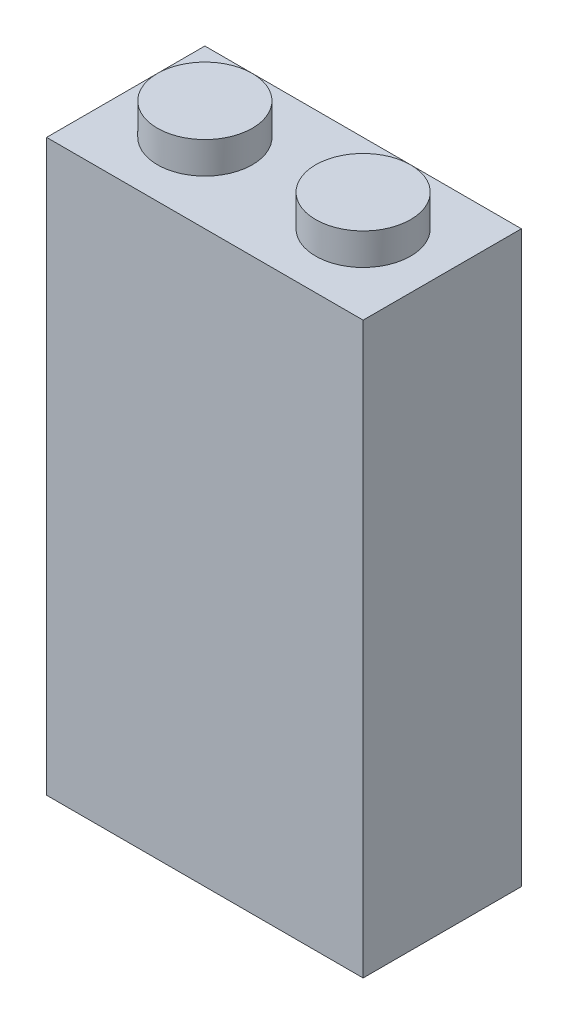
ISO-10303-21;
HEADER;
FILE_DESCRIPTION(('STEP AP214'),'2;1');
FILE_NAME('part.step','',(''),(''),'','','');
FILE_SCHEMA(('AUTOMOTIVE_DESIGN { 1 0 10303 214 1 1 1 1 }'));
ENDSEC;
DATA;
#1=APPLICATION_CONTEXT('core data for automotive mechanical design processes');
#2=APPLICATION_PROTOCOL_DEFINITION('international standard','automotive_design',2000,#1);
#3=PRODUCT_CONTEXT('',#1,'mechanical');
#4=PRODUCT('Part','Part','',(#3));
#5=PRODUCT_RELATED_PRODUCT_CATEGORY('part','',(#4));
#6=PRODUCT_DEFINITION_FORMATION('','',#4);
#7=PRODUCT_DEFINITION_CONTEXT('part definition',#1,'design');
#8=PRODUCT_DEFINITION('design','',#6,#7);
#9=PRODUCT_DEFINITION_SHAPE('','',#8);
#10=(LENGTH_UNIT() NAMED_UNIT(*) SI_UNIT(.MILLI.,.METRE.));
#11=(NAMED_UNIT(*) PLANE_ANGLE_UNIT() SI_UNIT($,.RADIAN.));
#12=(NAMED_UNIT(*) SI_UNIT($,.STERADIAN.) SOLID_ANGLE_UNIT());
#13=UNCERTAINTY_MEASURE_WITH_UNIT(LENGTH_MEASURE(1.E-05),#10,'distance_accuracy_value','');
#14=(GEOMETRIC_REPRESENTATION_CONTEXT(3) GLOBAL_UNCERTAINTY_ASSIGNED_CONTEXT((#13)) GLOBAL_UNIT_ASSIGNED_CONTEXT((#10,
#11,#12)) REPRESENTATION_CONTEXT('',''));
#15=CARTESIAN_POINT('',(0.,0.,0.));
#16=DIRECTION('',(0.,0.,1.));
#17=DIRECTION('',(1.,0.,0.));
#18=AXIS2_PLACEMENT_3D('',#15,#16,#17);
#19=CARTESIAN_POINT('',(0.,0.,0.));
#20=DIRECTION('',(0.,-1.,0.));
#21=DIRECTION('',(0.,0.,-1.));
#22=AXIS2_PLACEMENT_3D('',#19,#20,#21);
#23=PLANE('',#22);
#24=DIRECTION('',(0.,0.,1.));
#25=VECTOR('',#24,1.);
#26=CARTESIAN_POINT('',(0.,0.,0.));
#27=LINE('',#26,#25);
#28=CARTESIAN_POINT('',(0.,0.,-8.));
#29=VERTEX_POINT('',#28);
#30=CARTESIAN_POINT('',(0.,0.,0.));
#31=VERTEX_POINT('',#30);
#32=EDGE_CURVE('E190',#29,#31,#27,.T.);
#33=ORIENTED_EDGE('',*,*,#32,.F.);
#34=DIRECTION('',(-1.,0.,0.));
#35=VECTOR('',#34,1.);
#36=CARTESIAN_POINT('',(0.,0.,-8.));
#37=LINE('',#36,#35);
#38=CARTESIAN_POINT('',(16.,0.,-8.));
#39=VERTEX_POINT('',#38);
#40=EDGE_CURVE('E85',#39,#29,#37,.T.);
#41=ORIENTED_EDGE('',*,*,#40,.F.);
#42=DIRECTION('',(0.,0.,-1.));
#43=VECTOR('',#42,1.);
#44=CARTESIAN_POINT('',(16.,0.,0.));
#45=LINE('',#44,#43);
#46=CARTESIAN_POINT('',(16.,0.,0.));
#47=VERTEX_POINT('',#46);
#48=EDGE_CURVE('E208',#47,#39,#45,.T.);
#49=ORIENTED_EDGE('',*,*,#48,.F.);
#50=DIRECTION('',(1.,0.,0.));
#51=VECTOR('',#50,1.);
#52=CARTESIAN_POINT('',(0.,0.,0.));
#53=LINE('',#52,#51);
#54=EDGE_CURVE('E205',#31,#47,#53,.T.);
#55=ORIENTED_EDGE('',*,*,#54,.F.);
#56=EDGE_LOOP('',(#33,#41,#49,#55));
#57=FACE_BOUND('',#56,.T.);
#58=DIRECTION('',(-1.,0.,0.));
#59=VECTOR('',#58,1.);
#60=CARTESIAN_POINT('',(0.,0.,-6.4));
#61=LINE('',#60,#59);
#62=CARTESIAN_POINT('',(14.4,0.,-6.4));
#63=VERTEX_POINT('',#62);
#64=CARTESIAN_POINT('',(1.6,0.,-6.4));
#65=VERTEX_POINT('',#64);
#66=EDGE_CURVE('E135',#63,#65,#61,.T.);
#67=ORIENTED_EDGE('',*,*,#66,.T.);
#68=DIRECTION('',(0.,0.,1.));
#69=VECTOR('',#68,1.);
#70=CARTESIAN_POINT('',(1.6,0.,0.));
#71=LINE('',#70,#69);
#72=CARTESIAN_POINT('',(1.6,0.,-1.6));
#73=VERTEX_POINT('',#72);
#74=EDGE_CURVE('E169',#65,#73,#71,.T.);
#75=ORIENTED_EDGE('',*,*,#74,.T.);
#76=DIRECTION('',(1.,0.,0.));
#77=VECTOR('',#76,1.);
#78=CARTESIAN_POINT('',(0.,0.,-1.6));
#79=LINE('',#78,#77);
#80=CARTESIAN_POINT('',(14.4,0.,-1.6));
#81=VERTEX_POINT('',#80);
#82=EDGE_CURVE('E139',#73,#81,#79,.T.);
#83=ORIENTED_EDGE('',*,*,#82,.T.);
#84=DIRECTION('',(0.,0.,-1.));
#85=VECTOR('',#84,1.);
#86=CARTESIAN_POINT('',(14.4,0.,0.));
#87=LINE('',#86,#85);
#88=EDGE_CURVE('E55',#81,#63,#87,.T.);
#89=ORIENTED_EDGE('',*,*,#88,.T.);
#90=EDGE_LOOP('',(#67,#75,#83,#89));
#91=FACE_BOUND('',#90,.T.);
#92=ADVANCED_FACE('F39',(#57,#91),#23,.T.);
#93=CARTESIAN_POINT('',(0.,28.8,0.));
#94=DIRECTION('',(1.,0.,0.));
#95=DIRECTION('',(0.,0.,-1.));
#96=AXIS2_PLACEMENT_3D('',#93,#94,#95);
#97=PLANE('',#96);
#98=ORIENTED_EDGE('',*,*,#32,.T.);
#99=DIRECTION('',(0.,-1.,0.));
#100=VECTOR('',#99,1.);
#101=CARTESIAN_POINT('',(0.,28.8,0.));
#102=LINE('',#101,#100);
#103=CARTESIAN_POINT('',(0.,28.8,0.));
#104=VERTEX_POINT('',#103);
#105=EDGE_CURVE('E222',#104,#31,#102,.T.);
#106=ORIENTED_EDGE('',*,*,#105,.F.);
#107=DIRECTION('',(0.,0.,1.));
#108=VECTOR('',#107,1.);
#109=CARTESIAN_POINT('',(0.,28.8,0.));
#110=LINE('',#109,#108);
#111=CARTESIAN_POINT('',(0.,28.8,-8.));
#112=VERTEX_POINT('',#111);
#113=EDGE_CURVE('E191',#112,#104,#110,.T.);
#114=ORIENTED_EDGE('',*,*,#113,.F.);
#115=DIRECTION('',(0.,-1.,0.));
#116=VECTOR('',#115,1.);
#117=CARTESIAN_POINT('',(0.,28.8,-8.));
#118=LINE('',#117,#116);
#119=EDGE_CURVE('E201',#112,#29,#118,.T.);
#120=ORIENTED_EDGE('',*,*,#119,.T.);
#121=EDGE_LOOP('',(#98,#106,#114,#120));
#122=FACE_BOUND('',#121,.T.);
#123=ADVANCED_FACE('F41',(#122),#97,.F.);
#124=CARTESIAN_POINT('',(0.,28.8,0.));
#125=DIRECTION('',(0.,0.,-1.));
#126=DIRECTION('',(-1.,0.,0.));
#127=AXIS2_PLACEMENT_3D('',#124,#125,#126);
#128=PLANE('',#127);
#129=ORIENTED_EDGE('',*,*,#54,.T.);
#130=DIRECTION('',(0.,-1.,0.));
#131=VECTOR('',#130,1.);
#132=CARTESIAN_POINT('',(16.,28.8,0.));
#133=LINE('',#132,#131);
#134=CARTESIAN_POINT('',(16.,28.8,0.));
#135=VERTEX_POINT('',#134);
#136=EDGE_CURVE('E218',#135,#47,#133,.T.);
#137=ORIENTED_EDGE('',*,*,#136,.F.);
#138=DIRECTION('',(1.,0.,0.));
#139=VECTOR('',#138,1.);
#140=CARTESIAN_POINT('',(0.,28.8,0.));
#141=LINE('',#140,#139);
#142=EDGE_CURVE('E93',#104,#135,#141,.T.);
#143=ORIENTED_EDGE('',*,*,#142,.F.);
#144=ORIENTED_EDGE('',*,*,#105,.T.);
#145=EDGE_LOOP('',(#129,#137,#143,#144));
#146=FACE_BOUND('',#145,.T.);
#147=ADVANCED_FACE('F239',(#146),#128,.F.);
#148=CARTESIAN_POINT('',(16.,28.8,0.));
#149=DIRECTION('',(-1.,0.,0.));
#150=DIRECTION('',(0.,0.,1.));
#151=AXIS2_PLACEMENT_3D('',#148,#149,#150);
#152=PLANE('',#151);
#153=ORIENTED_EDGE('',*,*,#48,.T.);
#154=DIRECTION('',(0.,-1.,0.));
#155=VECTOR('',#154,1.);
#156=CARTESIAN_POINT('',(16.,28.8,-8.));
#157=LINE('',#156,#155);
#158=CARTESIAN_POINT('',(16.,28.8,-8.));
#159=VERTEX_POINT('',#158);
#160=EDGE_CURVE('E215',#159,#39,#157,.T.);
#161=ORIENTED_EDGE('',*,*,#160,.F.);
#162=DIRECTION('',(0.,0.,-1.));
#163=VECTOR('',#162,1.);
#164=CARTESIAN_POINT('',(16.,28.8,0.));
#165=LINE('',#164,#163);
#166=EDGE_CURVE('E196',#135,#159,#165,.T.);
#167=ORIENTED_EDGE('',*,*,#166,.F.);
#168=ORIENTED_EDGE('',*,*,#136,.T.);
#169=EDGE_LOOP('',(#153,#161,#167,#168));
#170=FACE_BOUND('',#169,.T.);
#171=ADVANCED_FACE('F244',(#170),#152,.F.);
#172=CARTESIAN_POINT('',(0.,28.8,-8.));
#173=DIRECTION('',(0.,0.,1.));
#174=DIRECTION('',(1.,0.,0.));
#175=AXIS2_PLACEMENT_3D('',#172,#173,#174);
#176=PLANE('',#175);
#177=ORIENTED_EDGE('',*,*,#40,.T.);
#178=ORIENTED_EDGE('',*,*,#119,.F.);
#179=DIRECTION('',(-1.,0.,0.));
#180=VECTOR('',#179,1.);
#181=CARTESIAN_POINT('',(0.,28.8,-8.));
#182=LINE('',#181,#180);
#183=EDGE_CURVE('E64',#159,#112,#182,.T.);
#184=ORIENTED_EDGE('',*,*,#183,.F.);
#185=ORIENTED_EDGE('',*,*,#160,.T.);
#186=EDGE_LOOP('',(#177,#178,#184,#185));
#187=FACE_BOUND('',#186,.T.);
#188=ADVANCED_FACE('F232',(#187),#176,.F.);
#189=CARTESIAN_POINT('',(0.,28.8,0.));
#190=DIRECTION('',(0.,-1.,0.));
#191=DIRECTION('',(0.,0.,-1.));
#192=AXIS2_PLACEMENT_3D('',#189,#190,#191);
#193=PLANE('',#192);
#194=CARTESIAN_POINT('',(4.,28.8,-4.));
#195=DIRECTION('',(0.,-1.,0.));
#196=DIRECTION('',(0.,0.,-1.));
#197=AXIS2_PLACEMENT_3D('',#194,#195,#196);
#198=CIRCLE('',#197,2.4);
#199=CARTESIAN_POINT('',(4.,28.8,-6.4));
#200=VERTEX_POINT('',#199);
#201=EDGE_CURVE('E11',#200,#200,#198,.F.);
#202=ORIENTED_EDGE('',*,*,#201,.F.);
#203=EDGE_LOOP('',(#202));
#204=FACE_BOUND('',#203,.T.);
#205=CARTESIAN_POINT('',(12.,28.8,-4.));
#206=DIRECTION('',(0.,-1.,0.));
#207=DIRECTION('',(0.,0.,-1.));
#208=AXIS2_PLACEMENT_3D('',#205,#206,#207);
#209=CIRCLE('',#208,2.4);
#210=CARTESIAN_POINT('',(12.,28.8,-6.4));
#211=VERTEX_POINT('',#210);
#212=EDGE_CURVE('E48',#211,#211,#209,.F.);
#213=ORIENTED_EDGE('',*,*,#212,.F.);
#214=EDGE_LOOP('',(#213));
#215=FACE_BOUND('',#214,.T.);
#216=ORIENTED_EDGE('',*,*,#113,.T.);
#217=ORIENTED_EDGE('',*,*,#142,.T.);
#218=ORIENTED_EDGE('',*,*,#166,.T.);
#219=ORIENTED_EDGE('',*,*,#183,.T.);
#220=EDGE_LOOP('',(#216,#217,#218,#219));
#221=FACE_BOUND('',#220,.T.);
#222=ADVANCED_FACE('F230',(#204,#215,#221),#193,.F.);
#223=CARTESIAN_POINT('',(12.,30.4,-4.));
#224=DIRECTION('',(0.,-1.,0.));
#225=DIRECTION('',(0.,0.,-1.));
#226=AXIS2_PLACEMENT_3D('',#223,#224,#225);
#227=CYLINDRICAL_SURFACE('',#226,2.4);
#228=CARTESIAN_POINT('',(12.,30.4,-4.));
#229=DIRECTION('',(0.,1.,0.));
#230=DIRECTION('',(0.,0.,1.));
#231=AXIS2_PLACEMENT_3D('',#228,#229,#230);
#232=CIRCLE('',#231,2.4);
#233=CARTESIAN_POINT('',(12.,30.4,-1.6));
#234=VERTEX_POINT('',#233);
#235=EDGE_CURVE('E186',#234,#234,#232,.T.);
#236=ORIENTED_EDGE('',*,*,#235,.F.);
#237=EDGE_LOOP('',(#236));
#238=FACE_BOUND('',#237,.T.);
#239=ORIENTED_EDGE('',*,*,#212,.T.);
#240=EDGE_LOOP('',(#239));
#241=FACE_BOUND('',#240,.T.);
#242=ADVANCED_FACE('F228',(#238,#241),#227,.T.);
#243=CARTESIAN_POINT('',(12.,30.4,-4.));
#244=DIRECTION('',(0.,1.,0.));
#245=DIRECTION('',(0.,0.,1.));
#246=AXIS2_PLACEMENT_3D('',#243,#244,#245);
#247=PLANE('',#246);
#248=ORIENTED_EDGE('',*,*,#235,.T.);
#249=EDGE_LOOP('',(#248));
#250=FACE_BOUND('',#249,.T.);
#251=ADVANCED_FACE('F290',(#250),#247,.T.);
#252=CARTESIAN_POINT('',(4.,30.4,-4.));
#253=DIRECTION('',(0.,-1.,0.));
#254=DIRECTION('',(0.,0.,-1.));
#255=AXIS2_PLACEMENT_3D('',#252,#253,#254);
#256=CYLINDRICAL_SURFACE('',#255,2.4);
#257=CARTESIAN_POINT('',(4.,30.4,-4.));
#258=DIRECTION('',(0.,1.,0.));
#259=DIRECTION('',(0.,0.,1.));
#260=AXIS2_PLACEMENT_3D('',#257,#258,#259);
#261=CIRCLE('',#260,2.4);
#262=CARTESIAN_POINT('',(4.,30.4,-1.6));
#263=VERTEX_POINT('',#262);
#264=EDGE_CURVE('E163',#263,#263,#261,.T.);
#265=ORIENTED_EDGE('',*,*,#264,.F.);
#266=EDGE_LOOP('',(#265));
#267=FACE_BOUND('',#266,.T.);
#268=ORIENTED_EDGE('',*,*,#201,.T.);
#269=EDGE_LOOP('',(#268));
#270=FACE_BOUND('',#269,.T.);
#271=ADVANCED_FACE('F286',(#267,#270),#256,.T.);
#272=CARTESIAN_POINT('',(4.,30.4,-4.));
#273=DIRECTION('',(0.,1.,0.));
#274=DIRECTION('',(0.,0.,1.));
#275=AXIS2_PLACEMENT_3D('',#272,#273,#274);
#276=PLANE('',#275);
#277=ORIENTED_EDGE('',*,*,#264,.T.);
#278=EDGE_LOOP('',(#277));
#279=FACE_BOUND('',#278,.T.);
#280=ADVANCED_FACE('F283',(#279),#276,.T.);
#281=CARTESIAN_POINT('',(1.6,28.8,0.));
#282=DIRECTION('',(1.,0.,0.));
#283=DIRECTION('',(0.,0.,-1.));
#284=AXIS2_PLACEMENT_3D('',#281,#282,#283);
#285=PLANE('',#284);
#286=ORIENTED_EDGE('',*,*,#74,.F.);
#287=DIRECTION('',(0.,-1.,0.));
#288=VECTOR('',#287,1.);
#289=CARTESIAN_POINT('',(1.6,28.8,-6.4));
#290=LINE('',#289,#288);
#291=CARTESIAN_POINT('',(1.6,27.2,-6.4));
#292=VERTEX_POINT('',#291);
#293=EDGE_CURVE('E133',#292,#65,#290,.T.);
#294=ORIENTED_EDGE('',*,*,#293,.F.);
#295=DIRECTION('',(0.,0.,1.));
#296=VECTOR('',#295,1.);
#297=CARTESIAN_POINT('',(1.6,27.2,0.));
#298=LINE('',#297,#296);
#299=CARTESIAN_POINT('',(1.6,27.2,-1.6));
#300=VERTEX_POINT('',#299);
#301=EDGE_CURVE('E120',#292,#300,#298,.T.);
#302=ORIENTED_EDGE('',*,*,#301,.T.);
#303=DIRECTION('',(0.,-1.,0.));
#304=VECTOR('',#303,1.);
#305=CARTESIAN_POINT('',(1.6,28.8,-1.6));
#306=LINE('',#305,#304);
#307=EDGE_CURVE('E131',#300,#73,#306,.T.);
#308=ORIENTED_EDGE('',*,*,#307,.T.);
#309=EDGE_LOOP('',(#286,#294,#302,#308));
#310=FACE_BOUND('',#309,.T.);
#311=ADVANCED_FACE('F130',(#310),#285,.T.);
#312=CARTESIAN_POINT('',(0.,28.8,-1.6));
#313=DIRECTION('',(0.,0.,-1.));
#314=DIRECTION('',(-1.,0.,0.));
#315=AXIS2_PLACEMENT_3D('',#312,#313,#314);
#316=PLANE('',#315);
#317=ORIENTED_EDGE('',*,*,#82,.F.);
#318=ORIENTED_EDGE('',*,*,#307,.F.);
#319=DIRECTION('',(1.,0.,0.));
#320=VECTOR('',#319,1.);
#321=CARTESIAN_POINT('',(0.,27.2,-1.6));
#322=LINE('',#321,#320);
#323=CARTESIAN_POINT('',(14.4,27.2,-1.6));
#324=VERTEX_POINT('',#323);
#325=EDGE_CURVE('E116',#300,#324,#322,.T.);
#326=ORIENTED_EDGE('',*,*,#325,.T.);
#327=DIRECTION('',(0.,-1.,0.));
#328=VECTOR('',#327,1.);
#329=CARTESIAN_POINT('',(14.4,28.8,-1.6));
#330=LINE('',#329,#328);
#331=EDGE_CURVE('E142',#324,#81,#330,.T.);
#332=ORIENTED_EDGE('',*,*,#331,.T.);
#333=EDGE_LOOP('',(#317,#318,#326,#332));
#334=FACE_BOUND('',#333,.T.);
#335=ADVANCED_FACE('F137',(#334),#316,.T.);
#336=CARTESIAN_POINT('',(14.4,28.8,0.));
#337=DIRECTION('',(-1.,0.,0.));
#338=DIRECTION('',(0.,0.,1.));
#339=AXIS2_PLACEMENT_3D('',#336,#337,#338);
#340=PLANE('',#339);
#341=ORIENTED_EDGE('',*,*,#88,.F.);
#342=ORIENTED_EDGE('',*,*,#331,.F.);
#343=DIRECTION('',(0.,0.,-1.));
#344=VECTOR('',#343,1.);
#345=CARTESIAN_POINT('',(14.4,27.2,0.));
#346=LINE('',#345,#344);
#347=CARTESIAN_POINT('',(14.4,27.2,-6.4));
#348=VERTEX_POINT('',#347);
#349=EDGE_CURVE('E121',#324,#348,#346,.T.);
#350=ORIENTED_EDGE('',*,*,#349,.T.);
#351=DIRECTION('',(0.,-1.,0.));
#352=VECTOR('',#351,1.);
#353=CARTESIAN_POINT('',(14.4,28.8,-6.4));
#354=LINE('',#353,#352);
#355=EDGE_CURVE('E149',#348,#63,#354,.T.);
#356=ORIENTED_EDGE('',*,*,#355,.T.);
#357=EDGE_LOOP('',(#341,#342,#350,#356));
#358=FACE_BOUND('',#357,.T.);
#359=ADVANCED_FACE('F253',(#358),#340,.T.);
#360=CARTESIAN_POINT('',(0.,28.8,-6.4));
#361=DIRECTION('',(0.,0.,1.));
#362=DIRECTION('',(1.,0.,0.));
#363=AXIS2_PLACEMENT_3D('',#360,#361,#362);
#364=PLANE('',#363);
#365=ORIENTED_EDGE('',*,*,#66,.F.);
#366=ORIENTED_EDGE('',*,*,#355,.F.);
#367=DIRECTION('',(-1.,0.,0.));
#368=VECTOR('',#367,1.);
#369=CARTESIAN_POINT('',(0.,27.2,-6.4));
#370=LINE('',#369,#368);
#371=EDGE_CURVE('E153',#348,#292,#370,.T.);
#372=ORIENTED_EDGE('',*,*,#371,.T.);
#373=ORIENTED_EDGE('',*,*,#293,.T.);
#374=EDGE_LOOP('',(#365,#366,#372,#373));
#375=FACE_BOUND('',#374,.T.);
#376=ADVANCED_FACE('F252',(#375),#364,.T.);
#377=CARTESIAN_POINT('',(0.,27.2,0.));
#378=DIRECTION('',(0.,-1.,0.));
#379=DIRECTION('',(0.,0.,-1.));
#380=AXIS2_PLACEMENT_3D('',#377,#378,#379);
#381=PLANE('',#380);
#382=CARTESIAN_POINT('',(4.,27.2,-4.));
#383=DIRECTION('',(0.,-1.,0.));
#384=DIRECTION('',(0.,0.,-1.));
#385=AXIS2_PLACEMENT_3D('',#382,#383,#384);
#386=CIRCLE('',#385,0.799999999999999);
#387=CARTESIAN_POINT('',(4.,27.2,-4.8));
#388=VERTEX_POINT('',#387);
#389=EDGE_CURVE('E147',#388,#388,#386,.F.);
#390=ORIENTED_EDGE('',*,*,#389,.T.);
#391=EDGE_LOOP('',(#390));
#392=FACE_BOUND('',#391,.T.);
#393=CARTESIAN_POINT('',(12.,27.2,-4.));
#394=DIRECTION('',(0.,-1.,0.));
#395=DIRECTION('',(0.,0.,-1.));
#396=AXIS2_PLACEMENT_3D('',#393,#394,#395);
#397=CIRCLE('',#396,0.799999999999999);
#398=CARTESIAN_POINT('',(12.,27.2,-4.8));
#399=VERTEX_POINT('',#398);
#400=EDGE_CURVE('E141',#399,#399,#397,.F.);
#401=ORIENTED_EDGE('',*,*,#400,.T.);
#402=EDGE_LOOP('',(#401));
#403=FACE_BOUND('',#402,.T.);
#404=ORIENTED_EDGE('',*,*,#301,.F.);
#405=ORIENTED_EDGE('',*,*,#371,.F.);
#406=ORIENTED_EDGE('',*,*,#349,.F.);
#407=ORIENTED_EDGE('',*,*,#325,.F.);
#408=EDGE_LOOP('',(#404,#405,#406,#407));
#409=FACE_BOUND('',#408,.T.);
#410=ADVANCED_FACE('F118',(#392,#403,#409),#381,.T.);
#411=CARTESIAN_POINT('',(12.,30.4,-4.));
#412=DIRECTION('',(0.,-1.,0.));
#413=DIRECTION('',(0.,0.,-1.));
#414=AXIS2_PLACEMENT_3D('',#411,#412,#413);
#415=CYLINDRICAL_SURFACE('',#414,0.799999999999999);
#416=CARTESIAN_POINT('',(12.,28.8,-4.));
#417=DIRECTION('',(0.,1.,0.));
#418=DIRECTION('',(0.,0.,1.));
#419=AXIS2_PLACEMENT_3D('',#416,#417,#418);
#420=CIRCLE('',#419,0.799999999999999);
#421=CARTESIAN_POINT('',(12.,28.8,-3.2));
#422=VERTEX_POINT('',#421);
#423=EDGE_CURVE('E165',#422,#422,#420,.T.);
#424=ORIENTED_EDGE('',*,*,#423,.T.);
#425=EDGE_LOOP('',(#424));
#426=FACE_BOUND('',#425,.T.);
#427=ORIENTED_EDGE('',*,*,#400,.F.);
#428=EDGE_LOOP('',(#427));
#429=FACE_BOUND('',#428,.T.);
#430=ADVANCED_FACE('F266',(#426,#429),#415,.F.);
#431=CARTESIAN_POINT('',(12.,28.8,-4.));
#432=DIRECTION('',(0.,1.,0.));
#433=DIRECTION('',(0.,0.,1.));
#434=AXIS2_PLACEMENT_3D('',#431,#432,#433);
#435=PLANE('',#434);
#436=ORIENTED_EDGE('',*,*,#423,.F.);
#437=EDGE_LOOP('',(#436));
#438=FACE_BOUND('',#437,.T.);
#439=ADVANCED_FACE('F270',(#438),#435,.F.);
#440=CARTESIAN_POINT('',(4.,30.4,-4.));
#441=DIRECTION('',(0.,-1.,0.));
#442=DIRECTION('',(0.,0.,-1.));
#443=AXIS2_PLACEMENT_3D('',#440,#441,#442);
#444=CYLINDRICAL_SURFACE('',#443,0.799999999999999);
#445=CARTESIAN_POINT('',(4.,28.8,-4.));
#446=DIRECTION('',(0.,1.,0.));
#447=DIRECTION('',(0.,0.,1.));
#448=AXIS2_PLACEMENT_3D('',#445,#446,#447);
#449=CIRCLE('',#448,0.799999999999999);
#450=CARTESIAN_POINT('',(4.,28.8,-3.2));
#451=VERTEX_POINT('',#450);
#452=EDGE_CURVE('E170',#451,#451,#449,.T.);
#453=ORIENTED_EDGE('',*,*,#452,.T.);
#454=EDGE_LOOP('',(#453));
#455=FACE_BOUND('',#454,.T.);
#456=ORIENTED_EDGE('',*,*,#389,.F.);
#457=EDGE_LOOP('',(#456));
#458=FACE_BOUND('',#457,.T.);
#459=ADVANCED_FACE('F274',(#455,#458),#444,.F.);
#460=CARTESIAN_POINT('',(4.,28.8,-4.));
#461=DIRECTION('',(0.,1.,0.));
#462=DIRECTION('',(0.,0.,1.));
#463=AXIS2_PLACEMENT_3D('',#460,#461,#462);
#464=PLANE('',#463);
#465=ORIENTED_EDGE('',*,*,#452,.F.);
#466=EDGE_LOOP('',(#465));
#467=FACE_BOUND('',#466,.T.);
#468=ADVANCED_FACE('F278',(#467),#464,.F.);
#469=CLOSED_SHELL('',(#92,#123,#147,#171,#188,#222,#242,#251,#271,#280,#311,#335,#359,#376,#410,
#430,#439,#459,#468));
#470=MANIFOLD_SOLID_BREP('B2',#469);
#471=ADVANCED_BREP_SHAPE_REPRESENTATION('',(#18,#470),#14);
#472=SHAPE_DEFINITION_REPRESENTATION(#9,#471);
ENDSEC;
END-ISO-10303-21;
